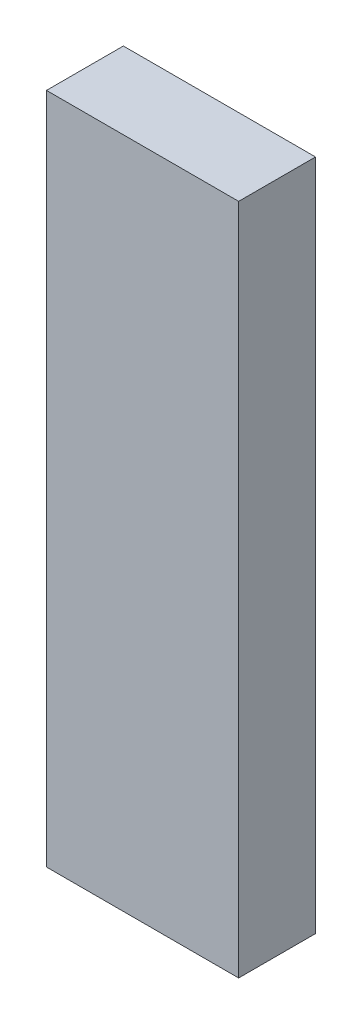
ISO-10303-21;
HEADER;
FILE_DESCRIPTION(('STEP AP214'),'2;1');
FILE_NAME('part.step','',(''),(''),'','','');
FILE_SCHEMA(('AUTOMOTIVE_DESIGN { 1 0 10303 214 1 1 1 1 }'));
ENDSEC;
DATA;
#1=APPLICATION_CONTEXT('core data for automotive mechanical design processes');
#2=APPLICATION_PROTOCOL_DEFINITION('international standard','automotive_design',2000,#1);
#3=PRODUCT_CONTEXT('',#1,'mechanical');
#4=PRODUCT('Part','Part','',(#3));
#5=PRODUCT_RELATED_PRODUCT_CATEGORY('part','',(#4));
#6=PRODUCT_DEFINITION_FORMATION('','',#4);
#7=PRODUCT_DEFINITION_CONTEXT('part definition',#1,'design');
#8=PRODUCT_DEFINITION('design','',#6,#7);
#9=PRODUCT_DEFINITION_SHAPE('','',#8);
#10=(LENGTH_UNIT() NAMED_UNIT(*) SI_UNIT(.MILLI.,.METRE.));
#11=(NAMED_UNIT(*) PLANE_ANGLE_UNIT() SI_UNIT($,.RADIAN.));
#12=(NAMED_UNIT(*) SI_UNIT($,.STERADIAN.) SOLID_ANGLE_UNIT());
#13=UNCERTAINTY_MEASURE_WITH_UNIT(LENGTH_MEASURE(1.E-05),#10,'distance_accuracy_value','');
#14=(GEOMETRIC_REPRESENTATION_CONTEXT(3) GLOBAL_UNCERTAINTY_ASSIGNED_CONTEXT((#13)) GLOBAL_UNIT_ASSIGNED_CONTEXT((#10,
#11,#12)) REPRESENTATION_CONTEXT('',''));
#15=CARTESIAN_POINT('',(0.,0.,0.));
#16=DIRECTION('',(0.,0.,1.));
#17=DIRECTION('',(1.,0.,0.));
#18=AXIS2_PLACEMENT_3D('',#15,#16,#17);
#19=CARTESIAN_POINT('',(-25.4,177.8,-10.16));
#20=DIRECTION('',(1.,0.,0.));
#21=DIRECTION('',(0.,0.,-1.));
#22=AXIS2_PLACEMENT_3D('',#19,#20,#21);
#23=PLANE('',#22);
#24=DIRECTION('',(0.,0.,1.));
#25=VECTOR('',#24,1.);
#26=CARTESIAN_POINT('',(-25.4,0.,-10.16));
#27=LINE('',#26,#25);
#28=CARTESIAN_POINT('',(-25.4,0.,-10.16));
#29=VERTEX_POINT('',#28);
#30=CARTESIAN_POINT('',(-25.4,0.,10.16));
#31=VERTEX_POINT('',#30);
#32=EDGE_CURVE('E113',#29,#31,#27,.T.);
#33=ORIENTED_EDGE('',*,*,#32,.T.);
#34=DIRECTION('',(0.,-1.,0.));
#35=VECTOR('',#34,1.);
#36=CARTESIAN_POINT('',(-25.4,177.8,10.16));
#37=LINE('',#36,#35);
#38=CARTESIAN_POINT('',(-25.4,177.8,10.16));
#39=VERTEX_POINT('',#38);
#40=EDGE_CURVE('E11',#39,#31,#37,.T.);
#41=ORIENTED_EDGE('',*,*,#40,.F.);
#42=DIRECTION('',(0.,0.,1.));
#43=VECTOR('',#42,1.);
#44=CARTESIAN_POINT('',(-25.4,177.8,-10.16));
#45=LINE('',#44,#43);
#46=CARTESIAN_POINT('',(-25.4,177.8,-10.16));
#47=VERTEX_POINT('',#46);
#48=EDGE_CURVE('E95',#47,#39,#45,.T.);
#49=ORIENTED_EDGE('',*,*,#48,.F.);
#50=DIRECTION('',(0.,-1.,0.));
#51=VECTOR('',#50,1.);
#52=CARTESIAN_POINT('',(-25.4,177.8,-10.16));
#53=LINE('',#52,#51);
#54=EDGE_CURVE('E62',#47,#29,#53,.T.);
#55=ORIENTED_EDGE('',*,*,#54,.T.);
#56=EDGE_LOOP('',(#33,#41,#49,#55));
#57=FACE_BOUND('',#56,.T.);
#58=ADVANCED_FACE('F45',(#57),#23,.F.);
#59=CARTESIAN_POINT('',(-25.4,177.8,10.16));
#60=DIRECTION('',(0.,0.,-1.));
#61=DIRECTION('',(-1.,0.,0.));
#62=AXIS2_PLACEMENT_3D('',#59,#60,#61);
#63=PLANE('',#62);
#64=DIRECTION('',(1.,0.,0.));
#65=VECTOR('',#64,1.);
#66=CARTESIAN_POINT('',(-25.4,0.,10.16));
#67=LINE('',#66,#65);
#68=CARTESIAN_POINT('',(25.4,0.,10.16));
#69=VERTEX_POINT('',#68);
#70=EDGE_CURVE('E101',#31,#69,#67,.T.);
#71=ORIENTED_EDGE('',*,*,#70,.T.);
#72=DIRECTION('',(0.,-1.,0.));
#73=VECTOR('',#72,1.);
#74=CARTESIAN_POINT('',(25.4,177.8,10.16));
#75=LINE('',#74,#73);
#76=CARTESIAN_POINT('',(25.4,177.8,10.16));
#77=VERTEX_POINT('',#76);
#78=EDGE_CURVE('E54',#77,#69,#75,.T.);
#79=ORIENTED_EDGE('',*,*,#78,.F.);
#80=DIRECTION('',(1.,0.,0.));
#81=VECTOR('',#80,1.);
#82=CARTESIAN_POINT('',(-25.4,177.8,10.16));
#83=LINE('',#82,#81);
#84=EDGE_CURVE('E87',#39,#77,#83,.T.);
#85=ORIENTED_EDGE('',*,*,#84,.F.);
#86=ORIENTED_EDGE('',*,*,#40,.T.);
#87=EDGE_LOOP('',(#71,#79,#85,#86));
#88=FACE_BOUND('',#87,.T.);
#89=ADVANCED_FACE('F100',(#88),#63,.F.);
#90=CARTESIAN_POINT('',(25.4,177.8,-10.16));
#91=DIRECTION('',(1.,0.,0.));
#92=DIRECTION('',(0.,0.,-1.));
#93=AXIS2_PLACEMENT_3D('',#90,#91,#92);
#94=PLANE('',#93);
#95=DIRECTION('',(0.,0.,1.));
#96=VECTOR('',#95,1.);
#97=CARTESIAN_POINT('',(25.4,0.,-10.16));
#98=LINE('',#97,#96);
#99=CARTESIAN_POINT('',(25.4,0.,-10.16));
#100=VERTEX_POINT('',#99);
#101=EDGE_CURVE('E118',#100,#69,#98,.T.);
#102=ORIENTED_EDGE('',*,*,#101,.F.);
#103=DIRECTION('',(0.,-1.,0.));
#104=VECTOR('',#103,1.);
#105=CARTESIAN_POINT('',(25.4,177.8,-10.16));
#106=LINE('',#105,#104);
#107=CARTESIAN_POINT('',(25.4,177.8,-10.16));
#108=VERTEX_POINT('',#107);
#109=EDGE_CURVE('E76',#108,#100,#106,.T.);
#110=ORIENTED_EDGE('',*,*,#109,.F.);
#111=DIRECTION('',(0.,0.,1.));
#112=VECTOR('',#111,1.);
#113=CARTESIAN_POINT('',(25.4,177.8,-10.16));
#114=LINE('',#113,#112);
#115=EDGE_CURVE('E94',#108,#77,#114,.T.);
#116=ORIENTED_EDGE('',*,*,#115,.T.);
#117=ORIENTED_EDGE('',*,*,#78,.T.);
#118=EDGE_LOOP('',(#102,#110,#116,#117));
#119=FACE_BOUND('',#118,.T.);
#120=ADVANCED_FACE('F105',(#119),#94,.T.);
#121=CARTESIAN_POINT('',(-25.4,177.8,-10.16));
#122=DIRECTION('',(0.,0.,-1.));
#123=DIRECTION('',(-1.,0.,0.));
#124=AXIS2_PLACEMENT_3D('',#121,#122,#123);
#125=PLANE('',#124);
#126=DIRECTION('',(1.,0.,0.));
#127=VECTOR('',#126,1.);
#128=CARTESIAN_POINT('',(-25.4,0.,-10.16));
#129=LINE('',#128,#127);
#130=EDGE_CURVE('E121',#29,#100,#129,.T.);
#131=ORIENTED_EDGE('',*,*,#130,.F.);
#132=ORIENTED_EDGE('',*,*,#54,.F.);
#133=DIRECTION('',(1.,0.,0.));
#134=VECTOR('',#133,1.);
#135=CARTESIAN_POINT('',(-25.4,177.8,-10.16));
#136=LINE('',#135,#134);
#137=EDGE_CURVE('E107',#47,#108,#136,.T.);
#138=ORIENTED_EDGE('',*,*,#137,.T.);
#139=ORIENTED_EDGE('',*,*,#109,.T.);
#140=EDGE_LOOP('',(#131,#132,#138,#139));
#141=FACE_BOUND('',#140,.T.);
#142=ADVANCED_FACE('F131',(#141),#125,.T.);
#143=CARTESIAN_POINT('',(0.,177.8,0.));
#144=DIRECTION('',(0.,1.,0.));
#145=DIRECTION('',(0.,0.,1.));
#146=AXIS2_PLACEMENT_3D('',#143,#144,#145);
#147=PLANE('',#146);
#148=ORIENTED_EDGE('',*,*,#48,.T.);
#149=ORIENTED_EDGE('',*,*,#84,.T.);
#150=ORIENTED_EDGE('',*,*,#115,.F.);
#151=ORIENTED_EDGE('',*,*,#137,.F.);
#152=EDGE_LOOP('',(#148,#149,#150,#151));
#153=FACE_BOUND('',#152,.T.);
#154=ADVANCED_FACE('F91',(#153),#147,.T.);
#155=CARTESIAN_POINT('',(0.,0.,0.));
#156=DIRECTION('',(0.,1.,0.));
#157=DIRECTION('',(0.,0.,1.));
#158=AXIS2_PLACEMENT_3D('',#155,#156,#157);
#159=PLANE('',#158);
#160=ORIENTED_EDGE('',*,*,#32,.F.);
#161=ORIENTED_EDGE('',*,*,#130,.T.);
#162=ORIENTED_EDGE('',*,*,#101,.T.);
#163=ORIENTED_EDGE('',*,*,#70,.F.);
#164=EDGE_LOOP('',(#160,#161,#162,#163));
#165=FACE_BOUND('',#164,.T.);
#166=ADVANCED_FACE('F130',(#165),#159,.F.);
#167=CLOSED_SHELL('',(#58,#89,#120,#142,#154,#166));
#168=MANIFOLD_SOLID_BREP('B2',#167);
#169=ADVANCED_BREP_SHAPE_REPRESENTATION('',(#18,#168),#14);
#170=SHAPE_DEFINITION_REPRESENTATION(#9,#169);
ENDSEC;
END-ISO-10303-21;
